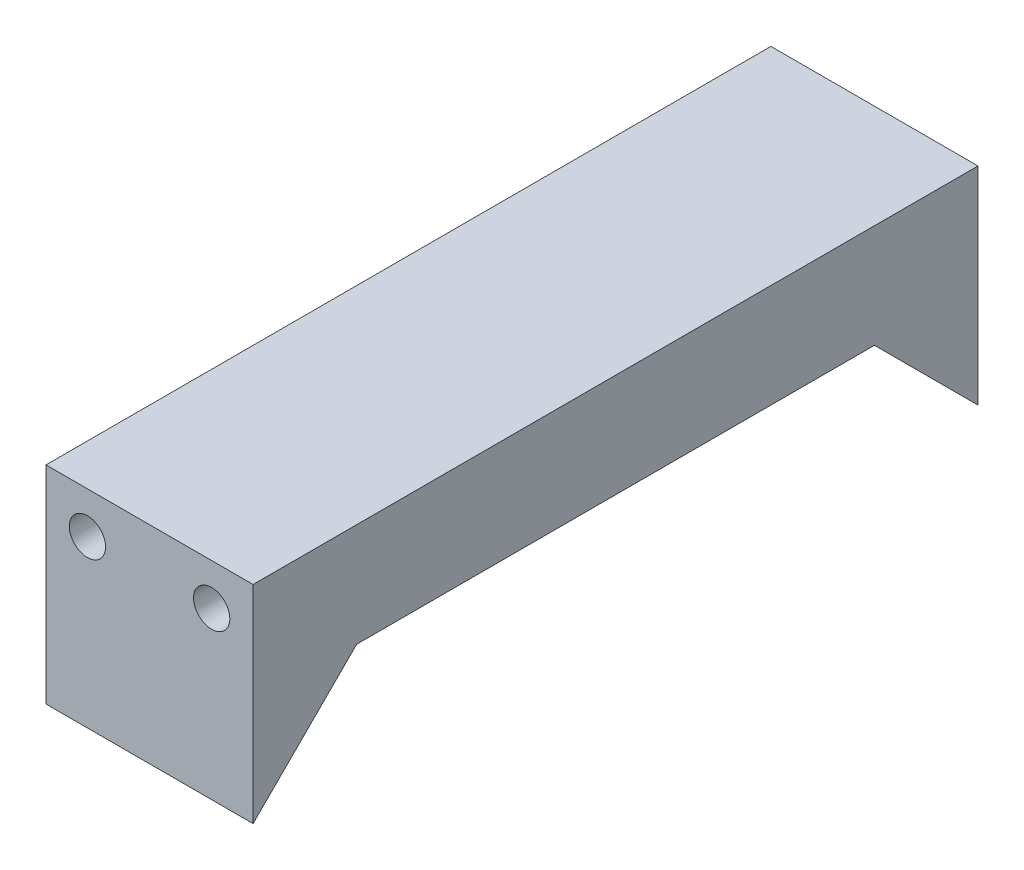
ISO-10303-21;
HEADER;
FILE_DESCRIPTION(('STEP AP214'),'2;1');
FILE_NAME('part.step','',(''),(''),'','','');
FILE_SCHEMA(('AUTOMOTIVE_DESIGN { 1 0 10303 214 1 1 1 1 }'));
ENDSEC;
DATA;
#1=APPLICATION_CONTEXT('core data for automotive mechanical design processes');
#2=APPLICATION_PROTOCOL_DEFINITION('international standard','automotive_design',2000,#1);
#3=PRODUCT_CONTEXT('',#1,'mechanical');
#4=PRODUCT('Part','Part','',(#3));
#5=PRODUCT_RELATED_PRODUCT_CATEGORY('part','',(#4));
#6=PRODUCT_DEFINITION_FORMATION('','',#4);
#7=PRODUCT_DEFINITION_CONTEXT('part definition',#1,'design');
#8=PRODUCT_DEFINITION('design','',#6,#7);
#9=PRODUCT_DEFINITION_SHAPE('','',#8);
#10=(LENGTH_UNIT() NAMED_UNIT(*) SI_UNIT(.MILLI.,.METRE.));
#11=(NAMED_UNIT(*) PLANE_ANGLE_UNIT() SI_UNIT($,.RADIAN.));
#12=(NAMED_UNIT(*) SI_UNIT($,.STERADIAN.) SOLID_ANGLE_UNIT());
#13=UNCERTAINTY_MEASURE_WITH_UNIT(LENGTH_MEASURE(1.E-05),#10,'distance_accuracy_value','');
#14=(GEOMETRIC_REPRESENTATION_CONTEXT(3) GLOBAL_UNCERTAINTY_ASSIGNED_CONTEXT((#13)) GLOBAL_UNIT_ASSIGNED_CONTEXT((#10,
#11,#12)) REPRESENTATION_CONTEXT('',''));
#15=CARTESIAN_POINT('',(0.,0.,0.));
#16=DIRECTION('',(0.,0.,1.));
#17=DIRECTION('',(1.,0.,0.));
#18=AXIS2_PLACEMENT_3D('',#15,#16,#17);
#19=CARTESIAN_POINT('',(20.,10.,0.));
#20=DIRECTION('',(0.,-1.,0.));
#21=DIRECTION('',(0.,0.,-1.));
#22=AXIS2_PLACEMENT_3D('',#19,#20,#21);
#23=PLANE('',#22);
#24=DIRECTION('',(0.,0.,1.));
#25=VECTOR('',#24,1.);
#26=CARTESIAN_POINT('',(0.,10.,0.));
#27=LINE('',#26,#25);
#28=CARTESIAN_POINT('',(0.,9.99999999999999,-59.9999999999999));
#29=VERTEX_POINT('',#28);
#30=CARTESIAN_POINT('',(0.,10.,-9.99999999999996));
#31=VERTEX_POINT('',#30);
#32=EDGE_CURVE('E116',#29,#31,#27,.T.);
#33=ORIENTED_EDGE('',*,*,#32,.F.);
#34=DIRECTION('',(-1.,0.,0.));
#35=VECTOR('',#34,1.);
#36=CARTESIAN_POINT('',(20.,9.99999999999999,-59.9999999999999));
#37=LINE('',#36,#35);
#38=CARTESIAN_POINT('',(20.,9.99999999999999,-59.9999999999999));
#39=VERTEX_POINT('',#38);
#40=EDGE_CURVE('E11',#39,#29,#37,.T.);
#41=ORIENTED_EDGE('',*,*,#40,.F.);
#42=DIRECTION('',(0.,0.,1.));
#43=VECTOR('',#42,1.);
#44=CARTESIAN_POINT('',(20.,10.,0.));
#45=LINE('',#44,#43);
#46=CARTESIAN_POINT('',(20.,10.,-9.99999999999996));
#47=VERTEX_POINT('',#46);
#48=EDGE_CURVE('E131',#39,#47,#45,.T.);
#49=ORIENTED_EDGE('',*,*,#48,.T.);
#50=DIRECTION('',(-1.,0.,0.));
#51=VECTOR('',#50,1.);
#52=CARTESIAN_POINT('',(20.,10.,-9.99999999999996));
#53=LINE('',#52,#51);
#54=EDGE_CURVE('E79',#47,#31,#53,.T.);
#55=ORIENTED_EDGE('',*,*,#54,.T.);
#56=EDGE_LOOP('',(#33,#41,#49,#55));
#57=FACE_BOUND('',#56,.T.);
#58=ADVANCED_FACE('F35',(#57),#23,.T.);
#59=CARTESIAN_POINT('',(20.,35.,-34.9999999999996));
#60=DIRECTION('',(0.,-0.707106781186552,0.707106781186544));
#61=DIRECTION('',(0.,-0.707106781186544,-0.707106781186551));
#62=AXIS2_PLACEMENT_3D('',#59,#60,#61);
#63=PLANE('',#62);
#64=DIRECTION('',(0.,0.707106781186544,0.707106781186552));
#65=VECTOR('',#64,1.);
#66=CARTESIAN_POINT('',(0.,35.,-34.9999999999996));
#67=LINE('',#66,#65);
#68=CARTESIAN_POINT('',(0.,0.,-70.));
#69=VERTEX_POINT('',#68);
#70=EDGE_CURVE('E119',#69,#29,#67,.T.);
#71=ORIENTED_EDGE('',*,*,#70,.F.);
#72=DIRECTION('',(-1.,0.,0.));
#73=VECTOR('',#72,1.);
#74=CARTESIAN_POINT('',(20.,0.,-70.));
#75=LINE('',#74,#73);
#76=CARTESIAN_POINT('',(20.,0.,-70.));
#77=VERTEX_POINT('',#76);
#78=EDGE_CURVE('E43',#77,#69,#75,.T.);
#79=ORIENTED_EDGE('',*,*,#78,.F.);
#80=DIRECTION('',(0.,0.707106781186544,0.707106781186552));
#81=VECTOR('',#80,1.);
#82=CARTESIAN_POINT('',(20.,35.,-34.9999999999996));
#83=LINE('',#82,#81);
#84=EDGE_CURVE('E143',#77,#39,#83,.T.);
#85=ORIENTED_EDGE('',*,*,#84,.T.);
#86=ORIENTED_EDGE('',*,*,#40,.T.);
#87=EDGE_LOOP('',(#71,#79,#85,#86));
#88=FACE_BOUND('',#87,.T.);
#89=ADVANCED_FACE('F142',(#88),#63,.T.);
#90=CARTESIAN_POINT('',(20.,0.,-70.));
#91=DIRECTION('',(0.,0.,1.));
#92=DIRECTION('',(1.,0.,0.));
#93=AXIS2_PLACEMENT_3D('',#90,#91,#92);
#94=PLANE('',#93);
#95=CARTESIAN_POINT('',(4.,16.,-70.));
#96=DIRECTION('',(0.,0.,-1.));
#97=DIRECTION('',(-1.,0.,0.));
#98=AXIS2_PLACEMENT_3D('',#95,#96,#97);
#99=CIRCLE('',#98,1.75);
#100=CARTESIAN_POINT('',(2.25,16.,-70.));
#101=VERTEX_POINT('',#100);
#102=EDGE_CURVE('E154',#101,#101,#99,.T.);
#103=ORIENTED_EDGE('',*,*,#102,.F.);
#104=EDGE_LOOP('',(#103));
#105=FACE_BOUND('',#104,.T.);
#106=CARTESIAN_POINT('',(16.,16.,-70.));
#107=DIRECTION('',(0.,0.,-1.));
#108=DIRECTION('',(-1.,0.,0.));
#109=AXIS2_PLACEMENT_3D('',#106,#107,#108);
#110=CIRCLE('',#109,1.75);
#111=CARTESIAN_POINT('',(14.25,16.,-70.));
#112=VERTEX_POINT('',#111);
#113=EDGE_CURVE('E151',#112,#112,#110,.T.);
#114=ORIENTED_EDGE('',*,*,#113,.F.);
#115=EDGE_LOOP('',(#114));
#116=FACE_BOUND('',#115,.T.);
#117=DIRECTION('',(0.,1.,0.));
#118=VECTOR('',#117,1.);
#119=CARTESIAN_POINT('',(0.,0.,-70.));
#120=LINE('',#119,#118);
#121=CARTESIAN_POINT('',(0.,20.,-70.));
#122=VERTEX_POINT('',#121);
#123=EDGE_CURVE('E123',#69,#122,#120,.T.);
#124=ORIENTED_EDGE('',*,*,#123,.T.);
#125=DIRECTION('',(-1.,0.,0.));
#126=VECTOR('',#125,1.);
#127=CARTESIAN_POINT('',(20.,20.,-70.));
#128=LINE('',#127,#126);
#129=CARTESIAN_POINT('',(20.,20.,-70.));
#130=VERTEX_POINT('',#129);
#131=EDGE_CURVE('E102',#130,#122,#128,.T.);
#132=ORIENTED_EDGE('',*,*,#131,.F.);
#133=DIRECTION('',(0.,1.,0.));
#134=VECTOR('',#133,1.);
#135=CARTESIAN_POINT('',(20.,0.,-70.));
#136=LINE('',#135,#134);
#137=EDGE_CURVE('E108',#77,#130,#136,.T.);
#138=ORIENTED_EDGE('',*,*,#137,.F.);
#139=ORIENTED_EDGE('',*,*,#78,.T.);
#140=EDGE_LOOP('',(#124,#132,#138,#139));
#141=FACE_BOUND('',#140,.T.);
#142=ADVANCED_FACE('F136',(#105,#116,#141),#94,.F.);
#143=CARTESIAN_POINT('',(20.,20.,0.));
#144=DIRECTION('',(0.,1.,0.));
#145=DIRECTION('',(0.,0.,1.));
#146=AXIS2_PLACEMENT_3D('',#143,#144,#145);
#147=PLANE('',#146);
#148=DIRECTION('',(0.,0.,-1.));
#149=VECTOR('',#148,1.);
#150=CARTESIAN_POINT('',(0.,20.,0.));
#151=LINE('',#150,#149);
#152=CARTESIAN_POINT('',(0.,20.,0.));
#153=VERTEX_POINT('',#152);
#154=EDGE_CURVE('E97',#153,#122,#151,.T.);
#155=ORIENTED_EDGE('',*,*,#154,.F.);
#156=DIRECTION('',(-1.,0.,0.));
#157=VECTOR('',#156,1.);
#158=CARTESIAN_POINT('',(20.,20.,0.));
#159=LINE('',#158,#157);
#160=CARTESIAN_POINT('',(20.,20.,0.));
#161=VERTEX_POINT('',#160);
#162=EDGE_CURVE('E92',#161,#153,#159,.T.);
#163=ORIENTED_EDGE('',*,*,#162,.F.);
#164=DIRECTION('',(0.,0.,-1.));
#165=VECTOR('',#164,1.);
#166=CARTESIAN_POINT('',(20.,20.,0.));
#167=LINE('',#166,#165);
#168=EDGE_CURVE('E95',#161,#130,#167,.T.);
#169=ORIENTED_EDGE('',*,*,#168,.T.);
#170=ORIENTED_EDGE('',*,*,#131,.T.);
#171=EDGE_LOOP('',(#155,#163,#169,#170));
#172=FACE_BOUND('',#171,.T.);
#173=ADVANCED_FACE('F94',(#172),#147,.T.);
#174=CARTESIAN_POINT('',(20.,0.,0.));
#175=DIRECTION('',(0.,0.,1.));
#176=DIRECTION('',(1.,0.,0.));
#177=AXIS2_PLACEMENT_3D('',#174,#175,#176);
#178=PLANE('',#177);
#179=CARTESIAN_POINT('',(4.,16.,0.));
#180=DIRECTION('',(0.,0.,-1.));
#181=DIRECTION('',(-1.,0.,0.));
#182=AXIS2_PLACEMENT_3D('',#179,#180,#181);
#183=CIRCLE('',#182,1.75);
#184=CARTESIAN_POINT('',(2.25,16.,0.));
#185=VERTEX_POINT('',#184);
#186=EDGE_CURVE('E120',#185,#185,#183,.T.);
#187=ORIENTED_EDGE('',*,*,#186,.T.);
#188=EDGE_LOOP('',(#187));
#189=FACE_BOUND('',#188,.T.);
#190=CARTESIAN_POINT('',(16.,16.,0.));
#191=DIRECTION('',(0.,0.,-1.));
#192=DIRECTION('',(-1.,0.,0.));
#193=AXIS2_PLACEMENT_3D('',#190,#191,#192);
#194=CIRCLE('',#193,1.75);
#195=CARTESIAN_POINT('',(14.25,16.,0.));
#196=VERTEX_POINT('',#195);
#197=EDGE_CURVE('E148',#196,#196,#194,.T.);
#198=ORIENTED_EDGE('',*,*,#197,.T.);
#199=EDGE_LOOP('',(#198));
#200=FACE_BOUND('',#199,.T.);
#201=DIRECTION('',(0.,1.,0.));
#202=VECTOR('',#201,1.);
#203=CARTESIAN_POINT('',(0.,0.,0.));
#204=LINE('',#203,#202);
#205=CARTESIAN_POINT('',(0.,0.,0.));
#206=VERTEX_POINT('',#205);
#207=EDGE_CURVE('E127',#206,#153,#204,.T.);
#208=ORIENTED_EDGE('',*,*,#207,.F.);
#209=DIRECTION('',(-1.,0.,0.));
#210=VECTOR('',#209,1.);
#211=CARTESIAN_POINT('',(20.,0.,0.));
#212=LINE('',#211,#210);
#213=CARTESIAN_POINT('',(20.,0.,0.));
#214=VERTEX_POINT('',#213);
#215=EDGE_CURVE('E72',#214,#206,#212,.T.);
#216=ORIENTED_EDGE('',*,*,#215,.F.);
#217=DIRECTION('',(0.,1.,0.));
#218=VECTOR('',#217,1.);
#219=CARTESIAN_POINT('',(20.,0.,0.));
#220=LINE('',#219,#218);
#221=EDGE_CURVE('E105',#214,#161,#220,.T.);
#222=ORIENTED_EDGE('',*,*,#221,.T.);
#223=ORIENTED_EDGE('',*,*,#162,.T.);
#224=EDGE_LOOP('',(#208,#216,#222,#223));
#225=FACE_BOUND('',#224,.T.);
#226=ADVANCED_FACE('F111',(#189,#200,#225),#178,.T.);
#227=CARTESIAN_POINT('',(20.,0.,0.));
#228=DIRECTION('',(0.,0.707106781186546,0.707106781186549));
#229=DIRECTION('',(0.,-0.707106781186549,0.707106781186546));
#230=AXIS2_PLACEMENT_3D('',#227,#228,#229);
#231=PLANE('',#230);
#232=DIRECTION('',(0.,0.707106781186549,-0.707106781186546));
#233=VECTOR('',#232,1.);
#234=CARTESIAN_POINT('',(0.,0.,0.));
#235=LINE('',#234,#233);
#236=EDGE_CURVE('E129',#206,#31,#235,.T.);
#237=ORIENTED_EDGE('',*,*,#236,.T.);
#238=ORIENTED_EDGE('',*,*,#54,.F.);
#239=DIRECTION('',(0.,0.707106781186549,-0.707106781186546));
#240=VECTOR('',#239,1.);
#241=CARTESIAN_POINT('',(20.,0.,0.));
#242=LINE('',#241,#240);
#243=EDGE_CURVE('E51',#214,#47,#242,.T.);
#244=ORIENTED_EDGE('',*,*,#243,.F.);
#245=ORIENTED_EDGE('',*,*,#215,.T.);
#246=EDGE_LOOP('',(#237,#238,#244,#245));
#247=FACE_BOUND('',#246,.T.);
#248=ADVANCED_FACE('F144',(#247),#231,.F.);
#249=CARTESIAN_POINT('',(20.,0.,0.));
#250=DIRECTION('',(1.,0.,0.));
#251=DIRECTION('',(0.,0.,-1.));
#252=AXIS2_PLACEMENT_3D('',#249,#250,#251);
#253=PLANE('',#252);
#254=ORIENTED_EDGE('',*,*,#48,.F.);
#255=ORIENTED_EDGE('',*,*,#84,.F.);
#256=ORIENTED_EDGE('',*,*,#137,.T.);
#257=ORIENTED_EDGE('',*,*,#168,.F.);
#258=ORIENTED_EDGE('',*,*,#221,.F.);
#259=ORIENTED_EDGE('',*,*,#243,.T.);
#260=EDGE_LOOP('',(#254,#255,#256,#257,#258,#259));
#261=FACE_BOUND('',#260,.T.);
#262=ADVANCED_FACE('F104',(#261),#253,.T.);
#263=CARTESIAN_POINT('',(0.,0.,0.));
#264=DIRECTION('',(1.,0.,0.));
#265=DIRECTION('',(0.,0.,-1.));
#266=AXIS2_PLACEMENT_3D('',#263,#264,#265);
#267=PLANE('',#266);
#268=ORIENTED_EDGE('',*,*,#32,.T.);
#269=ORIENTED_EDGE('',*,*,#236,.F.);
#270=ORIENTED_EDGE('',*,*,#207,.T.);
#271=ORIENTED_EDGE('',*,*,#154,.T.);
#272=ORIENTED_EDGE('',*,*,#123,.F.);
#273=ORIENTED_EDGE('',*,*,#70,.T.);
#274=EDGE_LOOP('',(#268,#269,#270,#271,#272,#273));
#275=FACE_BOUND('',#274,.T.);
#276=ADVANCED_FACE('F141',(#275),#267,.F.);
#277=CARTESIAN_POINT('',(16.,16.,0.));
#278=DIRECTION('',(0.,0.,-1.));
#279=DIRECTION('',(-1.,0.,0.));
#280=AXIS2_PLACEMENT_3D('',#277,#278,#279);
#281=CYLINDRICAL_SURFACE('',#280,1.75);
#282=ORIENTED_EDGE('',*,*,#197,.F.);
#283=EDGE_LOOP('',(#282));
#284=FACE_BOUND('',#283,.T.);
#285=ORIENTED_EDGE('',*,*,#113,.T.);
#286=EDGE_LOOP('',(#285));
#287=FACE_BOUND('',#286,.T.);
#288=ADVANCED_FACE('F165',(#284,#287),#281,.F.);
#289=CARTESIAN_POINT('',(4.,16.,0.));
#290=DIRECTION('',(0.,0.,-1.));
#291=DIRECTION('',(-1.,0.,0.));
#292=AXIS2_PLACEMENT_3D('',#289,#290,#291);
#293=CYLINDRICAL_SURFACE('',#292,1.75);
#294=ORIENTED_EDGE('',*,*,#186,.F.);
#295=EDGE_LOOP('',(#294));
#296=FACE_BOUND('',#295,.T.);
#297=ORIENTED_EDGE('',*,*,#102,.T.);
#298=EDGE_LOOP('',(#297));
#299=FACE_BOUND('',#298,.T.);
#300=ADVANCED_FACE('F162',(#296,#299),#293,.F.);
#301=CLOSED_SHELL('',(#58,#89,#142,#173,#226,#248,#262,#276,#288,#300));
#302=MANIFOLD_SOLID_BREP('B2',#301);
#303=ADVANCED_BREP_SHAPE_REPRESENTATION('',(#18,#302),#14);
#304=SHAPE_DEFINITION_REPRESENTATION(#9,#303);
ENDSEC;
END-ISO-10303-21;
